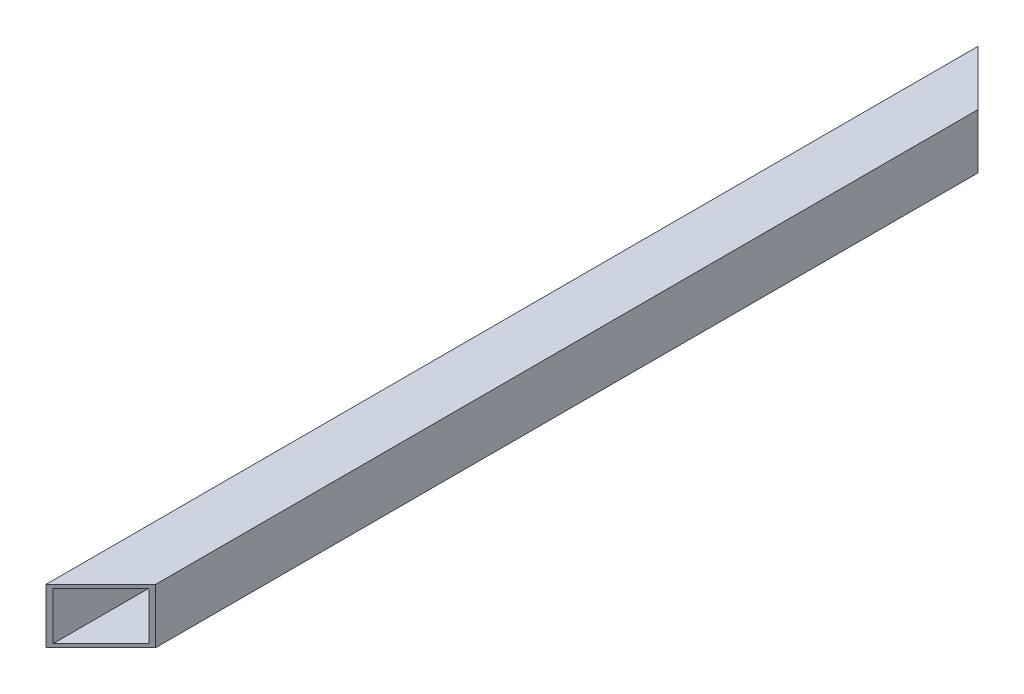
ISO-10303-21;
HEADER;
FILE_DESCRIPTION(('STEP AP214'),'2;1');
FILE_NAME('part.step','',(''),(''),'','','');
FILE_SCHEMA(('AUTOMOTIVE_DESIGN { 1 0 10303 214 1 1 1 1 }'));
ENDSEC;
DATA;
#1=APPLICATION_CONTEXT('core data for automotive mechanical design processes');
#2=APPLICATION_PROTOCOL_DEFINITION('international standard','automotive_design',2000,#1);
#3=PRODUCT_CONTEXT('',#1,'mechanical');
#4=PRODUCT('Part','Part','',(#3));
#5=PRODUCT_RELATED_PRODUCT_CATEGORY('part','',(#4));
#6=PRODUCT_DEFINITION_FORMATION('','',#4);
#7=PRODUCT_DEFINITION_CONTEXT('part definition',#1,'design');
#8=PRODUCT_DEFINITION('design','',#6,#7);
#9=PRODUCT_DEFINITION_SHAPE('','',#8);
#10=(LENGTH_UNIT() NAMED_UNIT(*) SI_UNIT(.MILLI.,.METRE.));
#11=(NAMED_UNIT(*) PLANE_ANGLE_UNIT() SI_UNIT($,.RADIAN.));
#12=(NAMED_UNIT(*) SI_UNIT($,.STERADIAN.) SOLID_ANGLE_UNIT());
#13=UNCERTAINTY_MEASURE_WITH_UNIT(LENGTH_MEASURE(1.E-05),#10,'distance_accuracy_value','');
#14=(GEOMETRIC_REPRESENTATION_CONTEXT(3) GLOBAL_UNCERTAINTY_ASSIGNED_CONTEXT((#13)) GLOBAL_UNIT_ASSIGNED_CONTEXT((#10,
#11,#12)) REPRESENTATION_CONTEXT('',''));
#15=CARTESIAN_POINT('',(0.,0.,0.));
#16=DIRECTION('',(0.,0.,1.));
#17=DIRECTION('',(1.,0.,0.));
#18=AXIS2_PLACEMENT_3D('',#15,#16,#17);
#19=CARTESIAN_POINT('',(12.7,-12.7,431.8));
#20=DIRECTION('',(-1.,0.,0.));
#21=DIRECTION('',(0.,0.,1.));
#22=AXIS2_PLACEMENT_3D('',#19,#20,#21);
#23=PLANE('',#22);
#24=DIRECTION('',(0.,1.,0.));
#25=VECTOR('',#24,1.);
#26=CARTESIAN_POINT('',(12.7,-12.7,406.4));
#27=LINE('',#26,#25);
#28=CARTESIAN_POINT('',(12.7,-12.7,406.4));
#29=VERTEX_POINT('',#28);
#30=CARTESIAN_POINT('',(12.7,12.7,406.4));
#31=VERTEX_POINT('',#30);
#32=EDGE_CURVE('E98',#29,#31,#27,.T.);
#33=ORIENTED_EDGE('',*,*,#32,.F.);
#34=DIRECTION('',(0.,0.,-1.));
#35=VECTOR('',#34,1.);
#36=CARTESIAN_POINT('',(12.7,-12.7,431.8));
#37=LINE('',#36,#35);
#38=CARTESIAN_POINT('',(12.7,-12.7,25.4));
#39=VERTEX_POINT('',#38);
#40=EDGE_CURVE('E53',#29,#39,#37,.T.);
#41=ORIENTED_EDGE('',*,*,#40,.T.);
#42=DIRECTION('',(0.,1.,0.));
#43=VECTOR('',#42,1.);
#44=CARTESIAN_POINT('',(12.7,-12.7,25.4));
#45=LINE('',#44,#43);
#46=CARTESIAN_POINT('',(12.7,12.7,25.4));
#47=VERTEX_POINT('',#46);
#48=EDGE_CURVE('E165',#39,#47,#45,.T.);
#49=ORIENTED_EDGE('',*,*,#48,.T.);
#50=DIRECTION('',(0.,0.,-1.));
#51=VECTOR('',#50,1.);
#52=CARTESIAN_POINT('',(12.7,12.7,431.8));
#53=LINE('',#52,#51);
#54=EDGE_CURVE('E108',#31,#47,#53,.T.);
#55=ORIENTED_EDGE('',*,*,#54,.F.);
#56=EDGE_LOOP('',(#33,#41,#49,#55));
#57=FACE_BOUND('',#56,.T.);
#58=ADVANCED_FACE('F32',(#57),#23,.F.);
#59=CARTESIAN_POINT('',(-12.7,12.7,431.8));
#60=DIRECTION('',(0.,-1.,0.));
#61=DIRECTION('',(0.,0.,-1.));
#62=AXIS2_PLACEMENT_3D('',#59,#60,#61);
#63=PLANE('',#62);
#64=DIRECTION('',(0.707106781186548,0.,-0.707106781186547));
#65=VECTOR('',#64,1.);
#66=CARTESIAN_POINT('',(12.7,12.7,406.4));
#67=LINE('',#66,#65);
#68=CARTESIAN_POINT('',(-12.7,12.7,431.8));
#69=VERTEX_POINT('',#68);
#70=EDGE_CURVE('E105',#69,#31,#67,.T.);
#71=ORIENTED_EDGE('',*,*,#70,.T.);
#72=ORIENTED_EDGE('',*,*,#54,.T.);
#73=DIRECTION('',(0.707106781186548,0.,0.707106781186547));
#74=VECTOR('',#73,1.);
#75=CARTESIAN_POINT('',(12.7,12.7,25.4));
#76=LINE('',#75,#74);
#77=CARTESIAN_POINT('',(-12.7,12.7,0.));
#78=VERTEX_POINT('',#77);
#79=EDGE_CURVE('E161',#78,#47,#76,.T.);
#80=ORIENTED_EDGE('',*,*,#79,.F.);
#81=DIRECTION('',(0.,0.,-1.));
#82=VECTOR('',#81,1.);
#83=CARTESIAN_POINT('',(-12.7,12.7,431.8));
#84=LINE('',#83,#82);
#85=EDGE_CURVE('E116',#69,#78,#84,.T.);
#86=ORIENTED_EDGE('',*,*,#85,.F.);
#87=EDGE_LOOP('',(#71,#72,#80,#86));
#88=FACE_BOUND('',#87,.T.);
#89=ADVANCED_FACE('F163',(#88),#63,.F.);
#90=CARTESIAN_POINT('',(-12.7,-12.7,431.8));
#91=DIRECTION('',(0.,1.,0.));
#92=DIRECTION('',(0.,0.,1.));
#93=AXIS2_PLACEMENT_3D('',#90,#91,#92);
#94=PLANE('',#93);
#95=DIRECTION('',(0.707106781186548,0.,-0.707106781186547));
#96=VECTOR('',#95,1.);
#97=CARTESIAN_POINT('',(12.7,-12.7,406.4));
#98=LINE('',#97,#96);
#99=CARTESIAN_POINT('',(-12.7,-12.7,431.8));
#100=VERTEX_POINT('',#99);
#101=EDGE_CURVE('E96',#100,#29,#98,.T.);
#102=ORIENTED_EDGE('',*,*,#101,.F.);
#103=DIRECTION('',(0.,0.,-1.));
#104=VECTOR('',#103,1.);
#105=CARTESIAN_POINT('',(-12.7,-12.7,431.8));
#106=LINE('',#105,#104);
#107=CARTESIAN_POINT('',(-12.7,-12.7,0.));
#108=VERTEX_POINT('',#107);
#109=EDGE_CURVE('E114',#100,#108,#106,.T.);
#110=ORIENTED_EDGE('',*,*,#109,.T.);
#111=DIRECTION('',(0.707106781186548,0.,0.707106781186547));
#112=VECTOR('',#111,1.);
#113=CARTESIAN_POINT('',(12.7,-12.7,25.4));
#114=LINE('',#113,#112);
#115=EDGE_CURVE('E113',#108,#39,#114,.T.);
#116=ORIENTED_EDGE('',*,*,#115,.T.);
#117=ORIENTED_EDGE('',*,*,#40,.F.);
#118=EDGE_LOOP('',(#102,#110,#116,#117));
#119=FACE_BOUND('',#118,.T.);
#120=ADVANCED_FACE('F112',(#119),#94,.F.);
#121=CARTESIAN_POINT('',(11.1125,-11.1125,431.8));
#122=DIRECTION('',(-1.,0.,0.));
#123=DIRECTION('',(0.,0.,1.));
#124=AXIS2_PLACEMENT_3D('',#121,#122,#123);
#125=PLANE('',#124);
#126=DIRECTION('',(0.,0.,-1.));
#127=VECTOR('',#126,1.);
#128=CARTESIAN_POINT('',(11.1125,-11.1125,431.8));
#129=LINE('',#128,#127);
#130=CARTESIAN_POINT('',(11.1125,-11.1125,407.9875));
#131=VERTEX_POINT('',#130);
#132=CARTESIAN_POINT('',(11.1125,-11.1125,23.8124999999999));
#133=VERTEX_POINT('',#132);
#134=EDGE_CURVE('E142',#131,#133,#129,.T.);
#135=ORIENTED_EDGE('',*,*,#134,.F.);
#136=DIRECTION('',(0.,1.,0.));
#137=VECTOR('',#136,1.);
#138=CARTESIAN_POINT('',(11.1125,-11.1125,407.9875));
#139=LINE('',#138,#137);
#140=CARTESIAN_POINT('',(11.1125,11.1125,407.9875));
#141=VERTEX_POINT('',#140);
#142=EDGE_CURVE('E46',#131,#141,#139,.T.);
#143=ORIENTED_EDGE('',*,*,#142,.T.);
#144=DIRECTION('',(0.,0.,-1.));
#145=VECTOR('',#144,1.);
#146=CARTESIAN_POINT('',(11.1125,11.1125,431.8));
#147=LINE('',#146,#145);
#148=CARTESIAN_POINT('',(11.1125,11.1125,23.8124999999999));
#149=VERTEX_POINT('',#148);
#150=EDGE_CURVE('E144',#141,#149,#147,.T.);
#151=ORIENTED_EDGE('',*,*,#150,.T.);
#152=DIRECTION('',(0.,1.,0.));
#153=VECTOR('',#152,1.);
#154=CARTESIAN_POINT('',(11.1125,-11.1125,23.8125));
#155=LINE('',#154,#153);
#156=EDGE_CURVE('E133',#133,#149,#155,.T.);
#157=ORIENTED_EDGE('',*,*,#156,.F.);
#158=EDGE_LOOP('',(#135,#143,#151,#157));
#159=FACE_BOUND('',#158,.T.);
#160=ADVANCED_FACE('F141',(#159),#125,.T.);
#161=CARTESIAN_POINT('',(-11.1125,11.1125,431.8));
#162=DIRECTION('',(0.,-1.,0.));
#163=DIRECTION('',(0.,0.,-1.));
#164=AXIS2_PLACEMENT_3D('',#161,#162,#163);
#165=PLANE('',#164);
#166=ORIENTED_EDGE('',*,*,#150,.F.);
#167=DIRECTION('',(-0.707106781186548,0.,0.707106781186547));
#168=VECTOR('',#167,1.);
#169=CARTESIAN_POINT('',(-11.90625,11.1125,431.00625));
#170=LINE('',#169,#168);
#171=CARTESIAN_POINT('',(-11.1125,11.1125,430.2125));
#172=VERTEX_POINT('',#171);
#173=EDGE_CURVE('E167',#141,#172,#170,.T.);
#174=ORIENTED_EDGE('',*,*,#173,.T.);
#175=DIRECTION('',(0.,0.,-1.));
#176=VECTOR('',#175,1.);
#177=CARTESIAN_POINT('',(-11.1125,11.1125,431.8));
#178=LINE('',#177,#176);
#179=CARTESIAN_POINT('',(-11.1125,11.1125,1.58749999999996));
#180=VERTEX_POINT('',#179);
#181=EDGE_CURVE('E153',#172,#180,#178,.T.);
#182=ORIENTED_EDGE('',*,*,#181,.T.);
#183=DIRECTION('',(-0.707106781186548,0.,-0.707106781186547));
#184=VECTOR('',#183,1.);
#185=CARTESIAN_POINT('',(203.99375,11.1125,216.69375));
#186=LINE('',#185,#184);
#187=EDGE_CURVE('E145',#149,#180,#186,.T.);
#188=ORIENTED_EDGE('',*,*,#187,.F.);
#189=EDGE_LOOP('',(#166,#174,#182,#188));
#190=FACE_BOUND('',#189,.T.);
#191=ADVANCED_FACE('F198',(#190),#165,.T.);
#192=CARTESIAN_POINT('',(-11.1125,-11.1125,431.8));
#193=DIRECTION('',(1.,0.,0.));
#194=DIRECTION('',(0.,0.,-1.));
#195=AXIS2_PLACEMENT_3D('',#192,#193,#194);
#196=PLANE('',#195);
#197=ORIENTED_EDGE('',*,*,#181,.F.);
#198=DIRECTION('',(0.,-1.,0.));
#199=VECTOR('',#198,1.);
#200=CARTESIAN_POINT('',(-11.1125,-11.1125,430.2125));
#201=LINE('',#200,#199);
#202=CARTESIAN_POINT('',(-11.1125,-11.1125,430.2125));
#203=VERTEX_POINT('',#202);
#204=EDGE_CURVE('E109',#172,#203,#201,.T.);
#205=ORIENTED_EDGE('',*,*,#204,.T.);
#206=DIRECTION('',(0.,0.,-1.));
#207=VECTOR('',#206,1.);
#208=CARTESIAN_POINT('',(-11.1125,-11.1125,431.8));
#209=LINE('',#208,#207);
#210=CARTESIAN_POINT('',(-11.1125,-11.1125,1.58750000000002));
#211=VERTEX_POINT('',#210);
#212=EDGE_CURVE('E147',#203,#211,#209,.T.);
#213=ORIENTED_EDGE('',*,*,#212,.T.);
#214=DIRECTION('',(0.,-1.,0.));
#215=VECTOR('',#214,1.);
#216=CARTESIAN_POINT('',(-11.1125,-11.1125,1.58749999999996));
#217=LINE('',#216,#215);
#218=EDGE_CURVE('E136',#180,#211,#217,.T.);
#219=ORIENTED_EDGE('',*,*,#218,.F.);
#220=EDGE_LOOP('',(#197,#205,#213,#219));
#221=FACE_BOUND('',#220,.T.);
#222=ADVANCED_FACE('F177',(#221),#196,.T.);
#223=CARTESIAN_POINT('',(-11.1125,-11.1125,431.8));
#224=DIRECTION('',(0.,1.,0.));
#225=DIRECTION('',(0.,0.,1.));
#226=AXIS2_PLACEMENT_3D('',#223,#224,#225);
#227=PLANE('',#226);
#228=ORIENTED_EDGE('',*,*,#212,.F.);
#229=DIRECTION('',(0.707106781186548,0.,-0.707106781186547));
#230=VECTOR('',#229,1.);
#231=CARTESIAN_POINT('',(-11.90625,-11.1125,431.00625));
#232=LINE('',#231,#230);
#233=EDGE_CURVE('E11',#203,#131,#232,.T.);
#234=ORIENTED_EDGE('',*,*,#233,.T.);
#235=ORIENTED_EDGE('',*,*,#134,.T.);
#236=DIRECTION('',(0.707106781186548,0.,0.707106781186547));
#237=VECTOR('',#236,1.);
#238=CARTESIAN_POINT('',(203.99375,-11.1125,216.69375));
#239=LINE('',#238,#237);
#240=EDGE_CURVE('E39',#211,#133,#239,.T.);
#241=ORIENTED_EDGE('',*,*,#240,.F.);
#242=EDGE_LOOP('',(#228,#234,#235,#241));
#243=FACE_BOUND('',#242,.T.);
#244=ADVANCED_FACE('F178',(#243),#227,.T.);
#245=CARTESIAN_POINT('',(-12.7,-12.7,431.8));
#246=DIRECTION('',(1.,0.,0.));
#247=DIRECTION('',(0.,0.,-1.));
#248=AXIS2_PLACEMENT_3D('',#245,#246,#247);
#249=PLANE('',#248);
#250=DIRECTION('',(0.,-1.,0.));
#251=VECTOR('',#250,1.);
#252=CARTESIAN_POINT('',(-12.7,-12.7,0.));
#253=LINE('',#252,#251);
#254=EDGE_CURVE('E118',#78,#108,#253,.T.);
#255=ORIENTED_EDGE('',*,*,#254,.T.);
#256=ORIENTED_EDGE('',*,*,#109,.F.);
#257=DIRECTION('',(0.,-1.,0.));
#258=VECTOR('',#257,1.);
#259=CARTESIAN_POINT('',(-12.7,-12.7,431.8));
#260=LINE('',#259,#258);
#261=EDGE_CURVE('E101',#69,#100,#260,.T.);
#262=ORIENTED_EDGE('',*,*,#261,.F.);
#263=ORIENTED_EDGE('',*,*,#85,.T.);
#264=EDGE_LOOP('',(#255,#256,#262,#263));
#265=FACE_BOUND('',#264,.T.);
#266=ADVANCED_FACE('F157',(#265),#249,.F.);
#267=CARTESIAN_POINT('',(12.7,-12.7,25.4));
#268=DIRECTION('',(-0.707106781186547,0.,0.707106781186548));
#269=DIRECTION('',(0.707106781186548,0.,0.707106781186547));
#270=AXIS2_PLACEMENT_3D('',#267,#268,#269);
#271=PLANE('',#270);
#272=ORIENTED_EDGE('',*,*,#156,.T.);
#273=ORIENTED_EDGE('',*,*,#187,.T.);
#274=ORIENTED_EDGE('',*,*,#218,.T.);
#275=ORIENTED_EDGE('',*,*,#240,.T.);
#276=EDGE_LOOP('',(#272,#273,#274,#275));
#277=FACE_BOUND('',#276,.T.);
#278=ORIENTED_EDGE('',*,*,#79,.T.);
#279=ORIENTED_EDGE('',*,*,#48,.F.);
#280=ORIENTED_EDGE('',*,*,#115,.F.);
#281=ORIENTED_EDGE('',*,*,#254,.F.);
#282=EDGE_LOOP('',(#278,#279,#280,#281));
#283=FACE_BOUND('',#282,.T.);
#284=ADVANCED_FACE('F130',(#277,#283),#271,.F.);
#285=CARTESIAN_POINT('',(12.7,-12.7,406.4));
#286=DIRECTION('',(0.707106781186547,0.,0.707106781186548));
#287=DIRECTION('',(0.707106781186548,0.,-0.707106781186547));
#288=AXIS2_PLACEMENT_3D('',#285,#286,#287);
#289=PLANE('',#288);
#290=ORIENTED_EDGE('',*,*,#233,.F.);
#291=ORIENTED_EDGE('',*,*,#204,.F.);
#292=ORIENTED_EDGE('',*,*,#173,.F.);
#293=ORIENTED_EDGE('',*,*,#142,.F.);
#294=EDGE_LOOP('',(#290,#291,#292,#293));
#295=FACE_BOUND('',#294,.T.);
#296=ORIENTED_EDGE('',*,*,#70,.F.);
#297=ORIENTED_EDGE('',*,*,#261,.T.);
#298=ORIENTED_EDGE('',*,*,#101,.T.);
#299=ORIENTED_EDGE('',*,*,#32,.T.);
#300=EDGE_LOOP('',(#296,#297,#298,#299));
#301=FACE_BOUND('',#300,.T.);
#302=ADVANCED_FACE('F97',(#295,#301),#289,.T.);
#303=CLOSED_SHELL('',(#58,#89,#120,#160,#191,#222,#244,#266,#284,#302));
#304=MANIFOLD_SOLID_BREP('B2',#303);
#305=ADVANCED_BREP_SHAPE_REPRESENTATION('',(#18,#304),#14);
#306=SHAPE_DEFINITION_REPRESENTATION(#9,#305);
ENDSEC;
END-ISO-10303-21;
